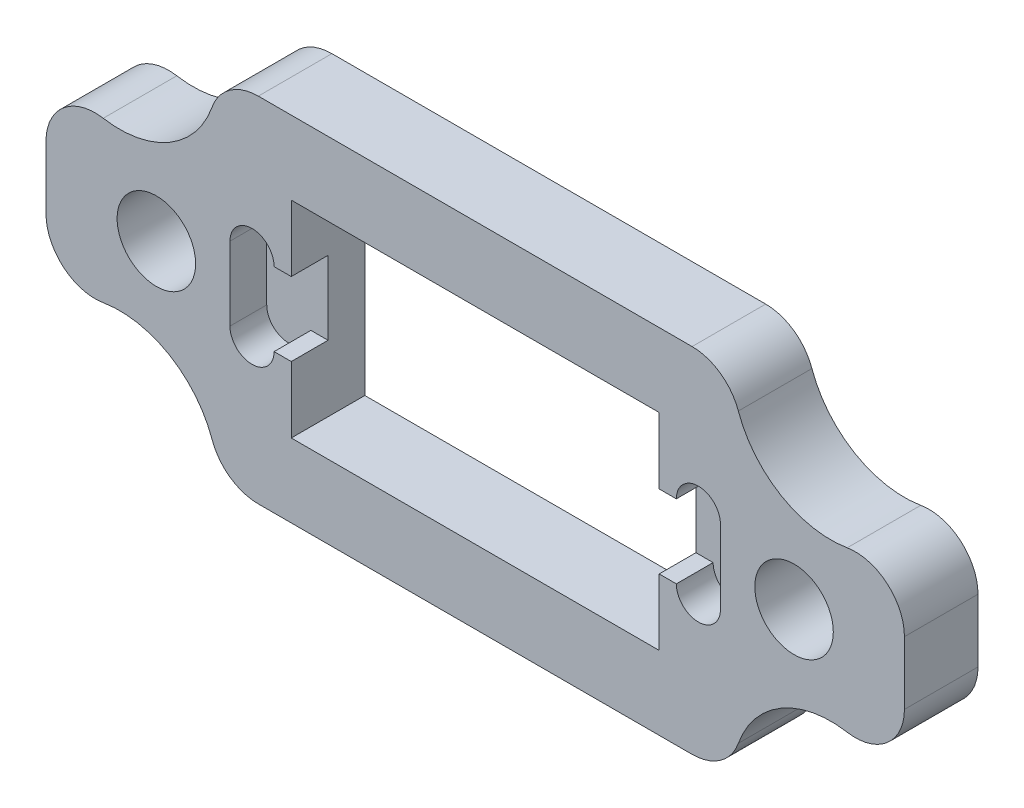
ISO-10303-21;
HEADER;
FILE_DESCRIPTION(('STEP AP214'),'2;1');
FILE_NAME('part.step','',(''),(''),'','','');
FILE_SCHEMA(('AUTOMOTIVE_DESIGN { 1 0 10303 214 1 1 1 1 }'));
ENDSEC;
DATA;
#1=APPLICATION_CONTEXT('core data for automotive mechanical design processes');
#2=APPLICATION_PROTOCOL_DEFINITION('international standard','automotive_design',2000,#1);
#3=PRODUCT_CONTEXT('',#1,'mechanical');
#4=PRODUCT('Part','Part','',(#3));
#5=PRODUCT_RELATED_PRODUCT_CATEGORY('part','',(#4));
#6=PRODUCT_DEFINITION_FORMATION('','',#4);
#7=PRODUCT_DEFINITION_CONTEXT('part definition',#1,'design');
#8=PRODUCT_DEFINITION('design','',#6,#7);
#9=PRODUCT_DEFINITION_SHAPE('','',#8);
#10=(LENGTH_UNIT() NAMED_UNIT(*) SI_UNIT(.MILLI.,.METRE.));
#11=(NAMED_UNIT(*) PLANE_ANGLE_UNIT() SI_UNIT($,.RADIAN.));
#12=(NAMED_UNIT(*) SI_UNIT($,.STERADIAN.) SOLID_ANGLE_UNIT());
#13=UNCERTAINTY_MEASURE_WITH_UNIT(LENGTH_MEASURE(1.E-05),#10,'distance_accuracy_value','');
#14=(GEOMETRIC_REPRESENTATION_CONTEXT(3) GLOBAL_UNCERTAINTY_ASSIGNED_CONTEXT((#13)) GLOBAL_UNIT_ASSIGNED_CONTEXT((#10,
#11,#12)) REPRESENTATION_CONTEXT('',''));
#15=CARTESIAN_POINT('',(0.,0.,0.));
#16=DIRECTION('',(0.,0.,1.));
#17=DIRECTION('',(1.,0.,0.));
#18=AXIS2_PLACEMENT_3D('',#15,#16,#17);
#19=CARTESIAN_POINT('',(0.,0.,3.));
#20=DIRECTION('',(0.,0.,-1.));
#21=DIRECTION('',(-1.,0.,0.));
#22=AXIS2_PLACEMENT_3D('',#19,#20,#21);
#23=PLANE('',#22);
#24=CARTESIAN_POINT('',(-13.,0.,3.));
#25=DIRECTION('',(0.,0.,1.));
#26=DIRECTION('',(1.,0.,0.));
#27=AXIS2_PLACEMENT_3D('',#24,#25,#26);
#28=CIRCLE('',#27,1.6);
#29=CARTESIAN_POINT('',(-11.4,0.,3.));
#30=VERTEX_POINT('',#29);
#31=EDGE_CURVE('E411',#30,#30,#28,.T.);
#32=ORIENTED_EDGE('',*,*,#31,.F.);
#33=EDGE_LOOP('',(#32));
#34=FACE_BOUND('',#33,.T.);
#35=CARTESIAN_POINT('',(13.,0.,3.));
#36=DIRECTION('',(0.,0.,1.));
#37=DIRECTION('',(1.,0.,0.));
#38=AXIS2_PLACEMENT_3D('',#35,#36,#37);
#39=CIRCLE('',#38,1.6);
#40=CARTESIAN_POINT('',(14.6,0.,3.));
#41=VERTEX_POINT('',#40);
#42=EDGE_CURVE('E548',#41,#41,#39,.T.);
#43=ORIENTED_EDGE('',*,*,#42,.F.);
#44=EDGE_LOOP('',(#43));
#45=FACE_BOUND('',#44,.T.);
#46=CARTESIAN_POINT('',(-14.5,-7.2,3.));
#47=DIRECTION('',(0.,0.,1.));
#48=DIRECTION('',(-1.,0.,0.));
#49=AXIS2_PLACEMENT_3D('',#46,#47,#48);
#50=CIRCLE('',#49,4.);
#51=CARTESIAN_POINT('',(-10.7287638336717,-5.86666666666667,3.));
#52=VERTEX_POINT('',#51);
#53=CARTESIAN_POINT('',(-15.1666666666667,-3.25594681126692,3.));
#54=VERTEX_POINT('',#53);
#55=EDGE_CURVE('E695',#52,#54,#50,.T.);
#56=ORIENTED_EDGE('',*,*,#55,.F.);
#57=CARTESIAN_POINT('',(-8.84314575050762,-5.2,3.));
#58=DIRECTION('',(0.,0.,-1.));
#59=DIRECTION('',(-1.,0.,0.));
#60=AXIS2_PLACEMENT_3D('',#57,#58,#59);
#61=CIRCLE('',#60,2.);
#62=CARTESIAN_POINT('',(-8.84314575050762,-7.2,3.));
#63=VERTEX_POINT('',#62);
#64=EDGE_CURVE('E472',#52,#63,#61,.F.);
#65=ORIENTED_EDGE('',*,*,#64,.T.);
#66=DIRECTION('',(1.,0.,0.));
#67=VECTOR('',#66,1.);
#68=CARTESIAN_POINT('',(-17.5,-7.2,3.));
#69=LINE('',#68,#67);
#70=CARTESIAN_POINT('',(8.84314575050763,-7.2,3.));
#71=VERTEX_POINT('',#70);
#72=EDGE_CURVE('E377',#63,#71,#69,.T.);
#73=ORIENTED_EDGE('',*,*,#72,.T.);
#74=CARTESIAN_POINT('',(8.84314575050763,-5.2,3.));
#75=DIRECTION('',(0.,0.,-1.));
#76=DIRECTION('',(-1.,0.,0.));
#77=AXIS2_PLACEMENT_3D('',#74,#75,#76);
#78=CIRCLE('',#77,2.);
#79=CARTESIAN_POINT('',(10.7287638336718,-5.86666666666667,3.));
#80=VERTEX_POINT('',#79);
#81=EDGE_CURVE('E469',#71,#80,#78,.F.);
#82=ORIENTED_EDGE('',*,*,#81,.T.);
#83=CARTESIAN_POINT('',(14.5,-7.2,3.));
#84=DIRECTION('',(0.,0.,1.));
#85=DIRECTION('',(1.,0.,0.));
#86=AXIS2_PLACEMENT_3D('',#83,#84,#85);
#87=CIRCLE('',#86,4.);
#88=CARTESIAN_POINT('',(15.1666666666667,-3.25594681126692,3.));
#89=VERTEX_POINT('',#88);
#90=EDGE_CURVE('E692',#89,#80,#87,.T.);
#91=ORIENTED_EDGE('',*,*,#90,.F.);
#92=CARTESIAN_POINT('',(15.5,-1.28392021690038,3.));
#93=DIRECTION('',(0.,0.,-1.));
#94=DIRECTION('',(-1.,0.,0.));
#95=AXIS2_PLACEMENT_3D('',#92,#93,#94);
#96=CIRCLE('',#95,2.);
#97=CARTESIAN_POINT('',(17.5,-1.28392021690038,3.));
#98=VERTEX_POINT('',#97);
#99=EDGE_CURVE('E466',#89,#98,#96,.F.);
#100=ORIENTED_EDGE('',*,*,#99,.T.);
#101=DIRECTION('',(0.,1.,0.));
#102=VECTOR('',#101,1.);
#103=CARTESIAN_POINT('',(17.5,-7.2,3.));
#104=LINE('',#103,#102);
#105=CARTESIAN_POINT('',(17.5,1.28392021690038,3.));
#106=VERTEX_POINT('',#105);
#107=EDGE_CURVE('E365',#98,#106,#104,.T.);
#108=ORIENTED_EDGE('',*,*,#107,.T.);
#109=CARTESIAN_POINT('',(15.5,1.28392021690038,3.));
#110=DIRECTION('',(0.,0.,-1.));
#111=DIRECTION('',(-1.,0.,0.));
#112=AXIS2_PLACEMENT_3D('',#109,#110,#111);
#113=CIRCLE('',#112,2.);
#114=CARTESIAN_POINT('',(15.1666666666667,3.25594681126692,3.));
#115=VERTEX_POINT('',#114);
#116=EDGE_CURVE('E463',#106,#115,#113,.F.);
#117=ORIENTED_EDGE('',*,*,#116,.T.);
#118=CARTESIAN_POINT('',(14.5,7.2,3.));
#119=DIRECTION('',(0.,0.,1.));
#120=DIRECTION('',(-1.,0.,0.));
#121=AXIS2_PLACEMENT_3D('',#118,#119,#120);
#122=CIRCLE('',#121,4.);
#123=CARTESIAN_POINT('',(10.7287638336718,5.86666666666667,3.));
#124=VERTEX_POINT('',#123);
#125=EDGE_CURVE('E537',#124,#115,#122,.T.);
#126=ORIENTED_EDGE('',*,*,#125,.F.);
#127=CARTESIAN_POINT('',(8.84314575050763,5.2,3.));
#128=DIRECTION('',(0.,0.,-1.));
#129=DIRECTION('',(-1.,0.,0.));
#130=AXIS2_PLACEMENT_3D('',#127,#128,#129);
#131=CIRCLE('',#130,2.);
#132=CARTESIAN_POINT('',(8.84314575050763,7.2,3.));
#133=VERTEX_POINT('',#132);
#134=EDGE_CURVE('E460',#124,#133,#131,.F.);
#135=ORIENTED_EDGE('',*,*,#134,.T.);
#136=DIRECTION('',(-1.,0.,0.));
#137=VECTOR('',#136,1.);
#138=CARTESIAN_POINT('',(-17.5,7.2,3.));
#139=LINE('',#138,#137);
#140=CARTESIAN_POINT('',(-8.84314575050762,7.2,3.));
#141=VERTEX_POINT('',#140);
#142=EDGE_CURVE('E369',#133,#141,#139,.T.);
#143=ORIENTED_EDGE('',*,*,#142,.T.);
#144=CARTESIAN_POINT('',(-8.84314575050762,5.2,3.));
#145=DIRECTION('',(0.,0.,-1.));
#146=DIRECTION('',(-1.,0.,0.));
#147=AXIS2_PLACEMENT_3D('',#144,#145,#146);
#148=CIRCLE('',#147,2.);
#149=CARTESIAN_POINT('',(-10.7287638336717,5.86666666666667,3.));
#150=VERTEX_POINT('',#149);
#151=EDGE_CURVE('E61',#141,#150,#148,.F.);
#152=ORIENTED_EDGE('',*,*,#151,.T.);
#153=CARTESIAN_POINT('',(-14.5,7.2,3.));
#154=DIRECTION('',(0.,0.,1.));
#155=DIRECTION('',(1.,0.,0.));
#156=AXIS2_PLACEMENT_3D('',#153,#154,#155);
#157=CIRCLE('',#156,4.);
#158=CARTESIAN_POINT('',(-15.1666666666667,3.25594681126692,3.));
#159=VERTEX_POINT('',#158);
#160=EDGE_CURVE('E515',#159,#150,#157,.T.);
#161=ORIENTED_EDGE('',*,*,#160,.F.);
#162=CARTESIAN_POINT('',(-15.5,1.28392021690038,3.));
#163=DIRECTION('',(0.,0.,-1.));
#164=DIRECTION('',(-1.,0.,0.));
#165=AXIS2_PLACEMENT_3D('',#162,#163,#164);
#166=CIRCLE('',#165,2.);
#167=CARTESIAN_POINT('',(-17.5,1.28392021690038,3.));
#168=VERTEX_POINT('',#167);
#169=EDGE_CURVE('E457',#159,#168,#166,.F.);
#170=ORIENTED_EDGE('',*,*,#169,.T.);
#171=DIRECTION('',(0.,-1.,0.));
#172=VECTOR('',#171,1.);
#173=CARTESIAN_POINT('',(-17.5,-7.2,3.));
#174=LINE('',#173,#172);
#175=CARTESIAN_POINT('',(-17.5,-1.28392021690038,3.));
#176=VERTEX_POINT('',#175);
#177=EDGE_CURVE('E373',#168,#176,#174,.T.);
#178=ORIENTED_EDGE('',*,*,#177,.T.);
#179=CARTESIAN_POINT('',(-15.5,-1.28392021690038,3.));
#180=DIRECTION('',(0.,0.,-1.));
#181=DIRECTION('',(-1.,0.,0.));
#182=AXIS2_PLACEMENT_3D('',#179,#180,#181);
#183=CIRCLE('',#182,2.);
#184=EDGE_CURVE('E454',#176,#54,#183,.F.);
#185=ORIENTED_EDGE('',*,*,#184,.T.);
#186=EDGE_LOOP('',(#56,#65,#73,#82,#91,#100,#108,#117,#126,#135,#143,#152,#161,#170,#178,#185));
#187=FACE_BOUND('',#186,.T.);
#188=DIRECTION('',(1.,0.,0.));
#189=VECTOR('',#188,1.);
#190=CARTESIAN_POINT('',(-10.,-1.5,3.));
#191=LINE('',#190,#189);
#192=CARTESIAN_POINT('',(-8.2,-1.5,3.));
#193=VERTEX_POINT('',#192);
#194=CARTESIAN_POINT('',(-7.5,-1.5,3.));
#195=VERTEX_POINT('',#194);
#196=EDGE_CURVE('E285',#193,#195,#191,.T.);
#197=ORIENTED_EDGE('',*,*,#196,.F.);
#198=CARTESIAN_POINT('',(-9.1,-1.5,3.));
#199=DIRECTION('',(0.,0.,1.));
#200=DIRECTION('',(1.,0.,0.));
#201=AXIS2_PLACEMENT_3D('',#198,#199,#200);
#202=CIRCLE('',#201,0.9);
#203=CARTESIAN_POINT('',(-10.,-1.5,3.));
#204=VERTEX_POINT('',#203);
#205=EDGE_CURVE('E728',#204,#193,#202,.T.);
#206=ORIENTED_EDGE('',*,*,#205,.F.);
#207=DIRECTION('',(0.,-1.,0.));
#208=VECTOR('',#207,1.);
#209=CARTESIAN_POINT('',(-10.,-1.5,3.));
#210=LINE('',#209,#208);
#211=CARTESIAN_POINT('',(-10.,1.5,3.));
#212=VERTEX_POINT('',#211);
#213=EDGE_CURVE('E286',#212,#204,#210,.T.);
#214=ORIENTED_EDGE('',*,*,#213,.F.);
#215=CARTESIAN_POINT('',(-9.1,1.5,3.));
#216=DIRECTION('',(0.,0.,1.));
#217=DIRECTION('',(1.,0.,0.));
#218=AXIS2_PLACEMENT_3D('',#215,#216,#217);
#219=CIRCLE('',#218,0.9);
#220=CARTESIAN_POINT('',(-8.2,1.5,3.));
#221=VERTEX_POINT('',#220);
#222=EDGE_CURVE('E593',#221,#212,#219,.T.);
#223=ORIENTED_EDGE('',*,*,#222,.F.);
#224=DIRECTION('',(-1.,0.,0.));
#225=VECTOR('',#224,1.);
#226=CARTESIAN_POINT('',(-10.,1.5,3.));
#227=LINE('',#226,#225);
#228=CARTESIAN_POINT('',(-7.5,1.5,3.));
#229=VERTEX_POINT('',#228);
#230=EDGE_CURVE('E573',#229,#221,#227,.T.);
#231=ORIENTED_EDGE('',*,*,#230,.F.);
#232=DIRECTION('',(0.,-1.,0.));
#233=VECTOR('',#232,1.);
#234=CARTESIAN_POINT('',(-7.5,-4.2,3.));
#235=LINE('',#234,#233);
#236=CARTESIAN_POINT('',(-7.5,4.2,3.));
#237=VERTEX_POINT('',#236);
#238=EDGE_CURVE('E328',#237,#229,#235,.T.);
#239=ORIENTED_EDGE('',*,*,#238,.F.);
#240=DIRECTION('',(-1.,0.,0.));
#241=VECTOR('',#240,1.);
#242=CARTESIAN_POINT('',(-7.5,4.2,3.));
#243=LINE('',#242,#241);
#244=CARTESIAN_POINT('',(7.5,4.2,3.));
#245=VERTEX_POINT('',#244);
#246=EDGE_CURVE('E323',#245,#237,#243,.T.);
#247=ORIENTED_EDGE('',*,*,#246,.F.);
#248=DIRECTION('',(0.,1.,0.));
#249=VECTOR('',#248,1.);
#250=CARTESIAN_POINT('',(7.5,-4.2,3.));
#251=LINE('',#250,#249);
#252=CARTESIAN_POINT('',(7.5,1.5,3.));
#253=VERTEX_POINT('',#252);
#254=EDGE_CURVE('E324',#253,#245,#251,.T.);
#255=ORIENTED_EDGE('',*,*,#254,.F.);
#256=CARTESIAN_POINT('',(8.2,1.5,3.));
#257=VERTEX_POINT('',#256);
#258=EDGE_CURVE('E292',#257,#253,#227,.T.);
#259=ORIENTED_EDGE('',*,*,#258,.F.);
#260=CARTESIAN_POINT('',(9.1,1.5,3.));
#261=DIRECTION('',(0.,0.,1.));
#262=DIRECTION('',(1.,0.,0.));
#263=AXIS2_PLACEMENT_3D('',#260,#261,#262);
#264=CIRCLE('',#263,0.9);
#265=CARTESIAN_POINT('',(10.,1.5,3.));
#266=VERTEX_POINT('',#265);
#267=EDGE_CURVE('E734',#266,#257,#264,.T.);
#268=ORIENTED_EDGE('',*,*,#267,.F.);
#269=DIRECTION('',(0.,1.,0.));
#270=VECTOR('',#269,1.);
#271=CARTESIAN_POINT('',(10.,-1.5,3.));
#272=LINE('',#271,#270);
#273=CARTESIAN_POINT('',(10.,-1.5,3.));
#274=VERTEX_POINT('',#273);
#275=EDGE_CURVE('E277',#274,#266,#272,.T.);
#276=ORIENTED_EDGE('',*,*,#275,.F.);
#277=CARTESIAN_POINT('',(9.1,-1.5,3.));
#278=DIRECTION('',(0.,0.,1.));
#279=DIRECTION('',(1.,0.,0.));
#280=AXIS2_PLACEMENT_3D('',#277,#278,#279);
#281=CIRCLE('',#280,0.9);
#282=CARTESIAN_POINT('',(8.2,-1.5,3.));
#283=VERTEX_POINT('',#282);
#284=EDGE_CURVE('E256',#283,#274,#281,.T.);
#285=ORIENTED_EDGE('',*,*,#284,.F.);
#286=CARTESIAN_POINT('',(7.5,-1.5,3.));
#287=VERTEX_POINT('',#286);
#288=EDGE_CURVE('E273',#287,#283,#191,.T.);
#289=ORIENTED_EDGE('',*,*,#288,.F.);
#290=CARTESIAN_POINT('',(7.5,-4.2,3.));
#291=VERTEX_POINT('',#290);
#292=EDGE_CURVE('E320',#291,#287,#251,.T.);
#293=ORIENTED_EDGE('',*,*,#292,.F.);
#294=DIRECTION('',(1.,0.,0.));
#295=VECTOR('',#294,1.);
#296=CARTESIAN_POINT('',(-7.5,-4.2,3.));
#297=LINE('',#296,#295);
#298=CARTESIAN_POINT('',(-7.5,-4.2,3.));
#299=VERTEX_POINT('',#298);
#300=EDGE_CURVE('E332',#299,#291,#297,.T.);
#301=ORIENTED_EDGE('',*,*,#300,.F.);
#302=EDGE_CURVE('E327',#195,#299,#235,.T.);
#303=ORIENTED_EDGE('',*,*,#302,.F.);
#304=EDGE_LOOP('',(#197,#206,#214,#223,#231,#239,#247,#255,#259,#268,#276,#285,#289,#293,#301,#303));
#305=FACE_BOUND('',#304,.T.);
#306=ADVANCED_FACE('F45',(#34,#45,#187,#305),#23,.F.);
#307=CARTESIAN_POINT('',(0.,0.,0.));
#308=DIRECTION('',(0.,0.,-1.));
#309=DIRECTION('',(-1.,0.,0.));
#310=AXIS2_PLACEMENT_3D('',#307,#308,#309);
#311=PLANE('',#310);
#312=DIRECTION('',(1.,0.,0.));
#313=VECTOR('',#312,1.);
#314=CARTESIAN_POINT('',(-17.5,-7.2,0.));
#315=LINE('',#314,#313);
#316=CARTESIAN_POINT('',(-8.84314575050762,-7.2,0.));
#317=VERTEX_POINT('',#316);
#318=CARTESIAN_POINT('',(8.84314575050763,-7.2,0.));
#319=VERTEX_POINT('',#318);
#320=EDGE_CURVE('E370',#317,#319,#315,.T.);
#321=ORIENTED_EDGE('',*,*,#320,.F.);
#322=CARTESIAN_POINT('',(-8.84314575050762,-5.2,0.));
#323=DIRECTION('',(0.,0.,-1.));
#324=DIRECTION('',(-1.,0.,0.));
#325=AXIS2_PLACEMENT_3D('',#322,#323,#324);
#326=CIRCLE('',#325,2.);
#327=CARTESIAN_POINT('',(-10.7287638336717,-5.86666666666667,0.));
#328=VERTEX_POINT('',#327);
#329=EDGE_CURVE('E443',#317,#328,#326,.T.);
#330=ORIENTED_EDGE('',*,*,#329,.T.);
#331=CARTESIAN_POINT('',(-14.5,-7.2,0.));
#332=DIRECTION('',(0.,0.,-1.));
#333=DIRECTION('',(-1.,0.,0.));
#334=AXIS2_PLACEMENT_3D('',#331,#332,#333);
#335=CIRCLE('',#334,4.);
#336=CARTESIAN_POINT('',(-15.1666666666667,-3.25594681126692,0.));
#337=VERTEX_POINT('',#336);
#338=EDGE_CURVE('E526',#337,#328,#335,.T.);
#339=ORIENTED_EDGE('',*,*,#338,.F.);
#340=CARTESIAN_POINT('',(-15.5,-1.28392021690038,0.));
#341=DIRECTION('',(0.,0.,-1.));
#342=DIRECTION('',(-1.,0.,0.));
#343=AXIS2_PLACEMENT_3D('',#340,#341,#342);
#344=CIRCLE('',#343,2.);
#345=CARTESIAN_POINT('',(-17.5,-1.28392021690038,0.));
#346=VERTEX_POINT('',#345);
#347=EDGE_CURVE('E425',#337,#346,#344,.T.);
#348=ORIENTED_EDGE('',*,*,#347,.T.);
#349=DIRECTION('',(0.,-1.,0.));
#350=VECTOR('',#349,1.);
#351=CARTESIAN_POINT('',(-17.5,-7.2,0.));
#352=LINE('',#351,#350);
#353=CARTESIAN_POINT('',(-17.5,1.28392021690038,0.));
#354=VERTEX_POINT('',#353);
#355=EDGE_CURVE('E389',#354,#346,#352,.T.);
#356=ORIENTED_EDGE('',*,*,#355,.F.);
#357=CARTESIAN_POINT('',(-15.5,1.28392021690038,0.));
#358=DIRECTION('',(0.,0.,-1.));
#359=DIRECTION('',(-1.,0.,0.));
#360=AXIS2_PLACEMENT_3D('',#357,#358,#359);
#361=CIRCLE('',#360,2.);
#362=CARTESIAN_POINT('',(-15.1666666666667,3.25594681126692,0.));
#363=VERTEX_POINT('',#362);
#364=EDGE_CURVE('E428',#354,#363,#361,.T.);
#365=ORIENTED_EDGE('',*,*,#364,.T.);
#366=CARTESIAN_POINT('',(-14.5,7.2,0.));
#367=DIRECTION('',(0.,0.,-1.));
#368=DIRECTION('',(-1.,0.,0.));
#369=AXIS2_PLACEMENT_3D('',#366,#367,#368);
#370=CIRCLE('',#369,4.);
#371=CARTESIAN_POINT('',(-10.7287638336717,5.86666666666667,0.));
#372=VERTEX_POINT('',#371);
#373=EDGE_CURVE('E514',#372,#363,#370,.T.);
#374=ORIENTED_EDGE('',*,*,#373,.F.);
#375=CARTESIAN_POINT('',(-8.84314575050762,5.2,0.));
#376=DIRECTION('',(0.,0.,-1.));
#377=DIRECTION('',(-1.,0.,0.));
#378=AXIS2_PLACEMENT_3D('',#375,#376,#377);
#379=CIRCLE('',#378,2.);
#380=CARTESIAN_POINT('',(-8.84314575050762,7.2,0.));
#381=VERTEX_POINT('',#380);
#382=EDGE_CURVE('E422',#372,#381,#379,.T.);
#383=ORIENTED_EDGE('',*,*,#382,.T.);
#384=DIRECTION('',(-1.,0.,0.));
#385=VECTOR('',#384,1.);
#386=CARTESIAN_POINT('',(-17.5,7.2,0.));
#387=LINE('',#386,#385);
#388=CARTESIAN_POINT('',(8.84314575050763,7.2,0.));
#389=VERTEX_POINT('',#388);
#390=EDGE_CURVE('E385',#389,#381,#387,.T.);
#391=ORIENTED_EDGE('',*,*,#390,.F.);
#392=CARTESIAN_POINT('',(8.84314575050763,5.2,0.));
#393=DIRECTION('',(0.,0.,-1.));
#394=DIRECTION('',(-1.,0.,0.));
#395=AXIS2_PLACEMENT_3D('',#392,#393,#394);
#396=CIRCLE('',#395,2.);
#397=CARTESIAN_POINT('',(10.7287638336718,5.86666666666667,0.));
#398=VERTEX_POINT('',#397);
#399=EDGE_CURVE('E431',#389,#398,#396,.T.);
#400=ORIENTED_EDGE('',*,*,#399,.T.);
#401=CARTESIAN_POINT('',(14.5,7.2,0.));
#402=DIRECTION('',(0.,0.,-1.));
#403=DIRECTION('',(-1.,0.,0.));
#404=AXIS2_PLACEMENT_3D('',#401,#402,#403);
#405=CIRCLE('',#404,4.);
#406=CARTESIAN_POINT('',(15.1666666666667,3.25594681126692,0.));
#407=VERTEX_POINT('',#406);
#408=EDGE_CURVE('E525',#407,#398,#405,.T.);
#409=ORIENTED_EDGE('',*,*,#408,.F.);
#410=CARTESIAN_POINT('',(15.5,1.28392021690038,0.));
#411=DIRECTION('',(0.,0.,-1.));
#412=DIRECTION('',(-1.,0.,0.));
#413=AXIS2_PLACEMENT_3D('',#410,#411,#412);
#414=CIRCLE('',#413,2.);
#415=CARTESIAN_POINT('',(17.5,1.28392021690038,0.));
#416=VERTEX_POINT('',#415);
#417=EDGE_CURVE('E434',#407,#416,#414,.T.);
#418=ORIENTED_EDGE('',*,*,#417,.T.);
#419=DIRECTION('',(0.,1.,0.));
#420=VECTOR('',#419,1.);
#421=CARTESIAN_POINT('',(17.5,-7.2,0.));
#422=LINE('',#421,#420);
#423=CARTESIAN_POINT('',(17.5,-1.28392021690038,0.));
#424=VERTEX_POINT('',#423);
#425=EDGE_CURVE('E364',#424,#416,#422,.T.);
#426=ORIENTED_EDGE('',*,*,#425,.F.);
#427=CARTESIAN_POINT('',(15.5,-1.28392021690038,0.));
#428=DIRECTION('',(0.,0.,-1.));
#429=DIRECTION('',(-1.,0.,0.));
#430=AXIS2_PLACEMENT_3D('',#427,#428,#429);
#431=CIRCLE('',#430,2.);
#432=CARTESIAN_POINT('',(15.1666666666667,-3.25594681126692,0.));
#433=VERTEX_POINT('',#432);
#434=EDGE_CURVE('E437',#424,#433,#431,.T.);
#435=ORIENTED_EDGE('',*,*,#434,.T.);
#436=CARTESIAN_POINT('',(14.5,-7.2,0.));
#437=DIRECTION('',(0.,0.,-1.));
#438=DIRECTION('',(-1.,0.,0.));
#439=AXIS2_PLACEMENT_3D('',#436,#437,#438);
#440=CIRCLE('',#439,4.);
#441=CARTESIAN_POINT('',(10.7287638336718,-5.86666666666667,0.));
#442=VERTEX_POINT('',#441);
#443=EDGE_CURVE('E686',#442,#433,#440,.T.);
#444=ORIENTED_EDGE('',*,*,#443,.F.);
#445=CARTESIAN_POINT('',(8.84314575050763,-5.2,0.));
#446=DIRECTION('',(0.,0.,-1.));
#447=DIRECTION('',(-1.,0.,0.));
#448=AXIS2_PLACEMENT_3D('',#445,#446,#447);
#449=CIRCLE('',#448,2.);
#450=EDGE_CURVE('E440',#442,#319,#449,.T.);
#451=ORIENTED_EDGE('',*,*,#450,.T.);
#452=EDGE_LOOP('',(#321,#330,#339,#348,#356,#365,#374,#383,#391,#400,#409,#418,#426,#435,#444,#451));
#453=FACE_BOUND('',#452,.T.);
#454=CARTESIAN_POINT('',(-13.,0.,0.));
#455=DIRECTION('',(0.,0.,-1.));
#456=DIRECTION('',(-1.,0.,0.));
#457=AXIS2_PLACEMENT_3D('',#454,#455,#456);
#458=CIRCLE('',#457,1.6);
#459=CARTESIAN_POINT('',(-14.6,0.,0.));
#460=VERTEX_POINT('',#459);
#461=EDGE_CURVE('E410',#460,#460,#458,.T.);
#462=ORIENTED_EDGE('',*,*,#461,.F.);
#463=EDGE_LOOP('',(#462));
#464=FACE_BOUND('',#463,.T.);
#465=CARTESIAN_POINT('',(13.,0.,0.));
#466=DIRECTION('',(0.,0.,-1.));
#467=DIRECTION('',(-1.,0.,0.));
#468=AXIS2_PLACEMENT_3D('',#465,#466,#467);
#469=CIRCLE('',#468,1.6);
#470=CARTESIAN_POINT('',(11.4,0.,0.));
#471=VERTEX_POINT('',#470);
#472=EDGE_CURVE('E406',#471,#471,#469,.T.);
#473=ORIENTED_EDGE('',*,*,#472,.F.);
#474=EDGE_LOOP('',(#473));
#475=FACE_BOUND('',#474,.T.);
#476=DIRECTION('',(1.,0.,0.));
#477=VECTOR('',#476,1.);
#478=CARTESIAN_POINT('',(-7.5,-4.2,0.));
#479=LINE('',#478,#477);
#480=CARTESIAN_POINT('',(-7.5,-4.2,0.));
#481=VERTEX_POINT('',#480);
#482=CARTESIAN_POINT('',(7.5,-4.2,0.));
#483=VERTEX_POINT('',#482);
#484=EDGE_CURVE('E347',#481,#483,#479,.T.);
#485=ORIENTED_EDGE('',*,*,#484,.T.);
#486=DIRECTION('',(0.,1.,0.));
#487=VECTOR('',#486,1.);
#488=CARTESIAN_POINT('',(7.5,-4.2,0.));
#489=LINE('',#488,#487);
#490=CARTESIAN_POINT('',(7.5,4.2,0.));
#491=VERTEX_POINT('',#490);
#492=EDGE_CURVE('E319',#483,#491,#489,.T.);
#493=ORIENTED_EDGE('',*,*,#492,.T.);
#494=DIRECTION('',(-1.,0.,0.));
#495=VECTOR('',#494,1.);
#496=CARTESIAN_POINT('',(-7.5,4.2,0.));
#497=LINE('',#496,#495);
#498=CARTESIAN_POINT('',(-7.5,4.2,0.));
#499=VERTEX_POINT('',#498);
#500=EDGE_CURVE('E339',#491,#499,#497,.T.);
#501=ORIENTED_EDGE('',*,*,#500,.T.);
#502=DIRECTION('',(0.,-1.,0.));
#503=VECTOR('',#502,1.);
#504=CARTESIAN_POINT('',(-7.5,-4.2,0.));
#505=LINE('',#504,#503);
#506=EDGE_CURVE('E343',#499,#481,#505,.T.);
#507=ORIENTED_EDGE('',*,*,#506,.T.);
#508=EDGE_LOOP('',(#485,#493,#501,#507));
#509=FACE_BOUND('',#508,.T.);
#510=ADVANCED_FACE('F520',(#453,#464,#475,#509),#311,.T.);
#511=CARTESIAN_POINT('',(17.5,-7.2,3.));
#512=DIRECTION('',(-1.,0.,0.));
#513=DIRECTION('',(0.,0.,1.));
#514=AXIS2_PLACEMENT_3D('',#511,#512,#513);
#515=PLANE('',#514);
#516=ORIENTED_EDGE('',*,*,#107,.F.);
#517=DIRECTION('',(0.,0.,1.));
#518=VECTOR('',#517,1.);
#519=CARTESIAN_POINT('',(17.5,-1.28392021690038,3.));
#520=LINE('',#519,#518);
#521=EDGE_CURVE('E485',#98,#424,#520,.F.);
#522=ORIENTED_EDGE('',*,*,#521,.T.);
#523=ORIENTED_EDGE('',*,*,#425,.T.);
#524=DIRECTION('',(0.,0.,1.));
#525=VECTOR('',#524,1.);
#526=CARTESIAN_POINT('',(17.5,1.28392021690038,3.));
#527=LINE('',#526,#525);
#528=EDGE_CURVE('E481',#416,#106,#527,.T.);
#529=ORIENTED_EDGE('',*,*,#528,.T.);
#530=EDGE_LOOP('',(#516,#522,#523,#529));
#531=FACE_BOUND('',#530,.T.);
#532=ADVANCED_FACE('F627',(#531),#515,.F.);
#533=CARTESIAN_POINT('',(-17.5,7.2,3.));
#534=DIRECTION('',(0.,-1.,0.));
#535=DIRECTION('',(0.,0.,-1.));
#536=AXIS2_PLACEMENT_3D('',#533,#534,#535);
#537=PLANE('',#536);
#538=ORIENTED_EDGE('',*,*,#142,.F.);
#539=DIRECTION('',(0.,0.,1.));
#540=VECTOR('',#539,1.);
#541=CARTESIAN_POINT('',(8.84314575050763,7.2,3.));
#542=LINE('',#541,#540);
#543=EDGE_CURVE('E499',#133,#389,#542,.F.);
#544=ORIENTED_EDGE('',*,*,#543,.T.);
#545=ORIENTED_EDGE('',*,*,#390,.T.);
#546=DIRECTION('',(0.,0.,1.));
#547=VECTOR('',#546,1.);
#548=CARTESIAN_POINT('',(-8.84314575050762,7.2,3.));
#549=LINE('',#548,#547);
#550=EDGE_CURVE('E495',#381,#141,#549,.T.);
#551=ORIENTED_EDGE('',*,*,#550,.T.);
#552=EDGE_LOOP('',(#538,#544,#545,#551));
#553=FACE_BOUND('',#552,.T.);
#554=ADVANCED_FACE('F531',(#553),#537,.F.);
#555=CARTESIAN_POINT('',(-17.5,-7.2,3.));
#556=DIRECTION('',(1.,0.,0.));
#557=DIRECTION('',(0.,0.,-1.));
#558=AXIS2_PLACEMENT_3D('',#555,#556,#557);
#559=PLANE('',#558);
#560=ORIENTED_EDGE('',*,*,#177,.F.);
#561=DIRECTION('',(0.,0.,1.));
#562=VECTOR('',#561,1.);
#563=CARTESIAN_POINT('',(-17.5,1.28392021690038,3.));
#564=LINE('',#563,#562);
#565=EDGE_CURVE('E507',#168,#354,#564,.F.);
#566=ORIENTED_EDGE('',*,*,#565,.T.);
#567=ORIENTED_EDGE('',*,*,#355,.T.);
#568=DIRECTION('',(0.,0.,1.));
#569=VECTOR('',#568,1.);
#570=CARTESIAN_POINT('',(-17.5,-1.28392021690038,3.));
#571=LINE('',#570,#569);
#572=EDGE_CURVE('E503',#346,#176,#571,.T.);
#573=ORIENTED_EDGE('',*,*,#572,.T.);
#574=EDGE_LOOP('',(#560,#566,#567,#573));
#575=FACE_BOUND('',#574,.T.);
#576=ADVANCED_FACE('F643',(#575),#559,.F.);
#577=CARTESIAN_POINT('',(-17.5,-7.2,3.));
#578=DIRECTION('',(0.,1.,0.));
#579=DIRECTION('',(0.,0.,1.));
#580=AXIS2_PLACEMENT_3D('',#577,#578,#579);
#581=PLANE('',#580);
#582=ORIENTED_EDGE('',*,*,#72,.F.);
#583=DIRECTION('',(0.,0.,1.));
#584=VECTOR('',#583,1.);
#585=CARTESIAN_POINT('',(-8.84314575050762,-7.2,3.));
#586=LINE('',#585,#584);
#587=EDGE_CURVE('E418',#63,#317,#586,.F.);
#588=ORIENTED_EDGE('',*,*,#587,.T.);
#589=ORIENTED_EDGE('',*,*,#320,.T.);
#590=DIRECTION('',(0.,0.,1.));
#591=VECTOR('',#590,1.);
#592=CARTESIAN_POINT('',(8.84314575050763,-7.2,3.));
#593=LINE('',#592,#591);
#594=EDGE_CURVE('E405',#319,#71,#593,.T.);
#595=ORIENTED_EDGE('',*,*,#594,.T.);
#596=EDGE_LOOP('',(#582,#588,#589,#595));
#597=FACE_BOUND('',#596,.T.);
#598=ADVANCED_FACE('F640',(#597),#581,.F.);
#599=CARTESIAN_POINT('',(7.5,-4.2,3.));
#600=DIRECTION('',(-1.,0.,0.));
#601=DIRECTION('',(0.,0.,1.));
#602=AXIS2_PLACEMENT_3D('',#599,#600,#601);
#603=PLANE('',#602);
#604=DIRECTION('',(0.,0.,1.));
#605=VECTOR('',#604,1.);
#606=CARTESIAN_POINT('',(7.5,-1.5,3.));
#607=LINE('',#606,#605);
#608=CARTESIAN_POINT('',(7.5,-1.5,1.5));
#609=VERTEX_POINT('',#608);
#610=EDGE_CURVE('E283',#609,#287,#607,.T.);
#611=ORIENTED_EDGE('',*,*,#610,.F.);
#612=DIRECTION('',(0.,-1.,0.));
#613=VECTOR('',#612,1.);
#614=CARTESIAN_POINT('',(7.5,-4.2,1.5));
#615=LINE('',#614,#613);
#616=CARTESIAN_POINT('',(7.5,1.5,1.5));
#617=VERTEX_POINT('',#616);
#618=EDGE_CURVE('E299',#617,#609,#615,.T.);
#619=ORIENTED_EDGE('',*,*,#618,.F.);
#620=DIRECTION('',(0.,0.,-1.));
#621=VECTOR('',#620,1.);
#622=CARTESIAN_POINT('',(7.5,1.5,3.));
#623=LINE('',#622,#621);
#624=EDGE_CURVE('E313',#253,#617,#623,.T.);
#625=ORIENTED_EDGE('',*,*,#624,.F.);
#626=ORIENTED_EDGE('',*,*,#254,.T.);
#627=DIRECTION('',(0.,0.,-1.));
#628=VECTOR('',#627,1.);
#629=CARTESIAN_POINT('',(7.5,4.2,3.));
#630=LINE('',#629,#628);
#631=EDGE_CURVE('E360',#245,#491,#630,.T.);
#632=ORIENTED_EDGE('',*,*,#631,.T.);
#633=ORIENTED_EDGE('',*,*,#492,.F.);
#634=DIRECTION('',(0.,0.,-1.));
#635=VECTOR('',#634,1.);
#636=CARTESIAN_POINT('',(7.5,-4.2,3.));
#637=LINE('',#636,#635);
#638=EDGE_CURVE('E335',#291,#483,#637,.T.);
#639=ORIENTED_EDGE('',*,*,#638,.F.);
#640=ORIENTED_EDGE('',*,*,#292,.T.);
#641=EDGE_LOOP('',(#611,#619,#625,#626,#632,#633,#639,#640));
#642=FACE_BOUND('',#641,.T.);
#643=ADVANCED_FACE('F624',(#642),#603,.T.);
#644=CARTESIAN_POINT('',(-7.5,4.2,3.));
#645=DIRECTION('',(0.,-1.,0.));
#646=DIRECTION('',(0.,0.,-1.));
#647=AXIS2_PLACEMENT_3D('',#644,#645,#646);
#648=PLANE('',#647);
#649=ORIENTED_EDGE('',*,*,#500,.F.);
#650=ORIENTED_EDGE('',*,*,#631,.F.);
#651=ORIENTED_EDGE('',*,*,#246,.T.);
#652=DIRECTION('',(0.,0.,-1.));
#653=VECTOR('',#652,1.);
#654=CARTESIAN_POINT('',(-7.5,4.2,3.));
#655=LINE('',#654,#653);
#656=EDGE_CURVE('E357',#237,#499,#655,.T.);
#657=ORIENTED_EDGE('',*,*,#656,.T.);
#658=EDGE_LOOP('',(#649,#650,#651,#657));
#659=FACE_BOUND('',#658,.T.);
#660=ADVANCED_FACE('F601',(#659),#648,.T.);
#661=CARTESIAN_POINT('',(-7.5,-4.2,3.));
#662=DIRECTION('',(1.,0.,0.));
#663=DIRECTION('',(0.,0.,-1.));
#664=AXIS2_PLACEMENT_3D('',#661,#662,#663);
#665=PLANE('',#664);
#666=DIRECTION('',(0.,0.,-1.));
#667=VECTOR('',#666,1.);
#668=CARTESIAN_POINT('',(-7.5,-1.5,3.));
#669=LINE('',#668,#667);
#670=CARTESIAN_POINT('',(-7.5,-1.5,1.5));
#671=VERTEX_POINT('',#670);
#672=EDGE_CURVE('E401',#195,#671,#669,.T.);
#673=ORIENTED_EDGE('',*,*,#672,.F.);
#674=ORIENTED_EDGE('',*,*,#302,.T.);
#675=DIRECTION('',(0.,0.,-1.));
#676=VECTOR('',#675,1.);
#677=CARTESIAN_POINT('',(-7.5,-4.2,3.));
#678=LINE('',#677,#676);
#679=EDGE_CURVE('E354',#299,#481,#678,.T.);
#680=ORIENTED_EDGE('',*,*,#679,.T.);
#681=ORIENTED_EDGE('',*,*,#506,.F.);
#682=ORIENTED_EDGE('',*,*,#656,.F.);
#683=ORIENTED_EDGE('',*,*,#238,.T.);
#684=DIRECTION('',(0.,0.,1.));
#685=VECTOR('',#684,1.);
#686=CARTESIAN_POINT('',(-7.5,1.5,3.));
#687=LINE('',#686,#685);
#688=CARTESIAN_POINT('',(-7.5,1.5,1.5));
#689=VERTEX_POINT('',#688);
#690=EDGE_CURVE('E398',#689,#229,#687,.T.);
#691=ORIENTED_EDGE('',*,*,#690,.F.);
#692=DIRECTION('',(0.,1.,0.));
#693=VECTOR('',#692,1.);
#694=CARTESIAN_POINT('',(-7.5,-4.2,1.5));
#695=LINE('',#694,#693);
#696=EDGE_CURVE('E381',#671,#689,#695,.T.);
#697=ORIENTED_EDGE('',*,*,#696,.F.);
#698=EDGE_LOOP('',(#673,#674,#680,#681,#682,#683,#691,#697));
#699=FACE_BOUND('',#698,.T.);
#700=ADVANCED_FACE('F597',(#699),#665,.T.);
#701=CARTESIAN_POINT('',(-7.5,-4.2,3.));
#702=DIRECTION('',(0.,1.,0.));
#703=DIRECTION('',(0.,0.,1.));
#704=AXIS2_PLACEMENT_3D('',#701,#702,#703);
#705=PLANE('',#704);
#706=ORIENTED_EDGE('',*,*,#484,.F.);
#707=ORIENTED_EDGE('',*,*,#679,.F.);
#708=ORIENTED_EDGE('',*,*,#300,.T.);
#709=ORIENTED_EDGE('',*,*,#638,.T.);
#710=EDGE_LOOP('',(#706,#707,#708,#709));
#711=FACE_BOUND('',#710,.T.);
#712=ADVANCED_FACE('F623',(#711),#705,.T.);
#713=CARTESIAN_POINT('',(0.,0.,1.5));
#714=DIRECTION('',(0.,0.,-1.));
#715=DIRECTION('',(-1.,0.,0.));
#716=AXIS2_PLACEMENT_3D('',#713,#714,#715);
#717=PLANE('',#716);
#718=DIRECTION('',(0.,-1.,0.));
#719=VECTOR('',#718,1.);
#720=CARTESIAN_POINT('',(-10.,-1.5,1.5));
#721=LINE('',#720,#719);
#722=CARTESIAN_POINT('',(-10.,1.5,1.5));
#723=VERTEX_POINT('',#722);
#724=CARTESIAN_POINT('',(-10.,-1.5,1.5));
#725=VERTEX_POINT('',#724);
#726=EDGE_CURVE('E565',#723,#725,#721,.T.);
#727=ORIENTED_EDGE('',*,*,#726,.T.);
#728=CARTESIAN_POINT('',(-9.1,-1.5,1.5));
#729=DIRECTION('',(0.,0.,1.));
#730=DIRECTION('',(1.,0.,0.));
#731=AXIS2_PLACEMENT_3D('',#728,#729,#730);
#732=CIRCLE('',#731,0.9);
#733=CARTESIAN_POINT('',(-8.2,-1.5,1.5));
#734=VERTEX_POINT('',#733);
#735=EDGE_CURVE('E737',#725,#734,#732,.T.);
#736=ORIENTED_EDGE('',*,*,#735,.T.);
#737=DIRECTION('',(1.,0.,0.));
#738=VECTOR('',#737,1.);
#739=CARTESIAN_POINT('',(-10.,-1.5,1.5));
#740=LINE('',#739,#738);
#741=EDGE_CURVE('E310',#734,#671,#740,.T.);
#742=ORIENTED_EDGE('',*,*,#741,.T.);
#743=ORIENTED_EDGE('',*,*,#696,.T.);
#744=DIRECTION('',(-1.,0.,0.));
#745=VECTOR('',#744,1.);
#746=CARTESIAN_POINT('',(-10.,1.5,1.5));
#747=LINE('',#746,#745);
#748=CARTESIAN_POINT('',(-8.2,1.5,1.5));
#749=VERTEX_POINT('',#748);
#750=EDGE_CURVE('E561',#689,#749,#747,.T.);
#751=ORIENTED_EDGE('',*,*,#750,.T.);
#752=CARTESIAN_POINT('',(-9.1,1.5,1.5));
#753=DIRECTION('',(0.,0.,1.));
#754=DIRECTION('',(1.,0.,0.));
#755=AXIS2_PLACEMENT_3D('',#752,#753,#754);
#756=CIRCLE('',#755,0.9);
#757=EDGE_CURVE('E266',#749,#723,#756,.T.);
#758=ORIENTED_EDGE('',*,*,#757,.T.);
#759=EDGE_LOOP('',(#727,#736,#742,#743,#751,#758));
#760=FACE_BOUND('',#759,.T.);
#761=ADVANCED_FACE('F610',(#760),#717,.F.);
#762=CARTESIAN_POINT('',(-10.,1.5,1.5));
#763=DIRECTION('',(0.,1.,0.));
#764=DIRECTION('',(0.,0.,1.));
#765=AXIS2_PLACEMENT_3D('',#762,#763,#764);
#766=PLANE('',#765);
#767=ORIENTED_EDGE('',*,*,#230,.T.);
#768=DIRECTION('',(0.,0.,1.));
#769=VECTOR('',#768,1.);
#770=CARTESIAN_POINT('',(-8.2,1.5,1.5));
#771=LINE('',#770,#769);
#772=EDGE_CURVE('E586',#221,#749,#771,.F.);
#773=ORIENTED_EDGE('',*,*,#772,.T.);
#774=ORIENTED_EDGE('',*,*,#750,.F.);
#775=ORIENTED_EDGE('',*,*,#690,.T.);
#776=EDGE_LOOP('',(#767,#773,#774,#775));
#777=FACE_BOUND('',#776,.T.);
#778=ADVANCED_FACE('F584',(#777),#766,.F.);
#779=CARTESIAN_POINT('',(-10.,-1.5,1.5));
#780=DIRECTION('',(0.,-1.,0.));
#781=DIRECTION('',(0.,0.,-1.));
#782=AXIS2_PLACEMENT_3D('',#779,#780,#781);
#783=PLANE('',#782);
#784=ORIENTED_EDGE('',*,*,#741,.F.);
#785=DIRECTION('',(0.,0.,1.));
#786=VECTOR('',#785,1.);
#787=CARTESIAN_POINT('',(-8.2,-1.5,1.5));
#788=LINE('',#787,#786);
#789=EDGE_CURVE('E717',#734,#193,#788,.T.);
#790=ORIENTED_EDGE('',*,*,#789,.T.);
#791=ORIENTED_EDGE('',*,*,#196,.T.);
#792=ORIENTED_EDGE('',*,*,#672,.T.);
#793=EDGE_LOOP('',(#784,#790,#791,#792));
#794=FACE_BOUND('',#793,.T.);
#795=ADVANCED_FACE('F763',(#794),#783,.F.);
#796=CARTESIAN_POINT('',(-10.,-1.5,1.5));
#797=DIRECTION('',(-1.,0.,0.));
#798=DIRECTION('',(0.,0.,1.));
#799=AXIS2_PLACEMENT_3D('',#796,#797,#798);
#800=PLANE('',#799);
#801=ORIENTED_EDGE('',*,*,#213,.T.);
#802=DIRECTION('',(0.,0.,1.));
#803=VECTOR('',#802,1.);
#804=CARTESIAN_POINT('',(-10.,-1.5,1.5));
#805=LINE('',#804,#803);
#806=EDGE_CURVE('E300',#725,#204,#805,.T.);
#807=ORIENTED_EDGE('',*,*,#806,.F.);
#808=ORIENTED_EDGE('',*,*,#726,.F.);
#809=DIRECTION('',(0.,0.,1.));
#810=VECTOR('',#809,1.);
#811=CARTESIAN_POINT('',(-10.,1.5,1.5));
#812=LINE('',#811,#810);
#813=EDGE_CURVE('E303',#723,#212,#812,.T.);
#814=ORIENTED_EDGE('',*,*,#813,.T.);
#815=EDGE_LOOP('',(#801,#807,#808,#814));
#816=FACE_BOUND('',#815,.T.);
#817=ADVANCED_FACE('F761',(#816),#800,.F.);
#818=ORIENTED_EDGE('',*,*,#288,.T.);
#819=DIRECTION('',(0.,0.,1.));
#820=VECTOR('',#819,1.);
#821=CARTESIAN_POINT('',(8.2,-1.5,1.5));
#822=LINE('',#821,#820);
#823=CARTESIAN_POINT('',(8.2,-1.5,1.5));
#824=VERTEX_POINT('',#823);
#825=EDGE_CURVE('E253',#283,#824,#822,.F.);
#826=ORIENTED_EDGE('',*,*,#825,.T.);
#827=EDGE_CURVE('E569',#609,#824,#740,.T.);
#828=ORIENTED_EDGE('',*,*,#827,.F.);
#829=ORIENTED_EDGE('',*,*,#610,.T.);
#830=EDGE_LOOP('',(#818,#826,#828,#829));
#831=FACE_BOUND('',#830,.T.);
#832=ADVANCED_FACE('F281',(#831),#783,.F.);
#833=CARTESIAN_POINT('',(8.2,1.5,1.5));
#834=VERTEX_POINT('',#833);
#835=EDGE_CURVE('E562',#834,#617,#747,.T.);
#836=ORIENTED_EDGE('',*,*,#835,.F.);
#837=DIRECTION('',(0.,0.,1.));
#838=VECTOR('',#837,1.);
#839=CARTESIAN_POINT('',(8.2,1.5,1.5));
#840=LINE('',#839,#838);
#841=EDGE_CURVE('E265',#834,#257,#840,.T.);
#842=ORIENTED_EDGE('',*,*,#841,.T.);
#843=ORIENTED_EDGE('',*,*,#258,.T.);
#844=ORIENTED_EDGE('',*,*,#624,.T.);
#845=EDGE_LOOP('',(#836,#842,#843,#844));
#846=FACE_BOUND('',#845,.T.);
#847=ADVANCED_FACE('F752',(#846),#766,.F.);
#848=DIRECTION('',(0.,1.,0.));
#849=VECTOR('',#848,1.);
#850=CARTESIAN_POINT('',(10.,-1.5,1.5));
#851=LINE('',#850,#849);
#852=CARTESIAN_POINT('',(10.,-1.5,1.5));
#853=VERTEX_POINT('',#852);
#854=CARTESIAN_POINT('',(10.,1.5,1.5));
#855=VERTEX_POINT('',#854);
#856=EDGE_CURVE('E290',#853,#855,#851,.T.);
#857=ORIENTED_EDGE('',*,*,#856,.T.);
#858=CARTESIAN_POINT('',(9.1,1.5,1.5));
#859=DIRECTION('',(0.,0.,1.));
#860=DIRECTION('',(1.,0.,0.));
#861=AXIS2_PLACEMENT_3D('',#858,#859,#860);
#862=CIRCLE('',#861,0.9);
#863=EDGE_CURVE('E279',#855,#834,#862,.T.);
#864=ORIENTED_EDGE('',*,*,#863,.T.);
#865=ORIENTED_EDGE('',*,*,#835,.T.);
#866=ORIENTED_EDGE('',*,*,#618,.T.);
#867=ORIENTED_EDGE('',*,*,#827,.T.);
#868=CARTESIAN_POINT('',(9.1,-1.5,1.5));
#869=DIRECTION('',(0.,0.,1.));
#870=DIRECTION('',(1.,0.,0.));
#871=AXIS2_PLACEMENT_3D('',#868,#869,#870);
#872=CIRCLE('',#871,0.9);
#873=EDGE_CURVE('E259',#824,#853,#872,.T.);
#874=ORIENTED_EDGE('',*,*,#873,.T.);
#875=EDGE_LOOP('',(#857,#864,#865,#866,#867,#874));
#876=FACE_BOUND('',#875,.T.);
#877=ADVANCED_FACE('F745',(#876),#717,.F.);
#878=CARTESIAN_POINT('',(10.,-1.5,1.5));
#879=DIRECTION('',(1.,0.,0.));
#880=DIRECTION('',(0.,0.,-1.));
#881=AXIS2_PLACEMENT_3D('',#878,#879,#880);
#882=PLANE('',#881);
#883=ORIENTED_EDGE('',*,*,#275,.T.);
#884=DIRECTION('',(0.,0.,1.));
#885=VECTOR('',#884,1.);
#886=CARTESIAN_POINT('',(10.,1.5,1.5));
#887=LINE('',#886,#885);
#888=EDGE_CURVE('E307',#855,#266,#887,.T.);
#889=ORIENTED_EDGE('',*,*,#888,.F.);
#890=ORIENTED_EDGE('',*,*,#856,.F.);
#891=DIRECTION('',(0.,0.,1.));
#892=VECTOR('',#891,1.);
#893=CARTESIAN_POINT('',(10.,-1.5,1.5));
#894=LINE('',#893,#892);
#895=EDGE_CURVE('E296',#853,#274,#894,.T.);
#896=ORIENTED_EDGE('',*,*,#895,.T.);
#897=EDGE_LOOP('',(#883,#889,#890,#896));
#898=FACE_BOUND('',#897,.T.);
#899=ADVANCED_FACE('F748',(#898),#882,.F.);
#900=CARTESIAN_POINT('',(13.,0.,-17.));
#901=DIRECTION('',(0.,0.,1.));
#902=DIRECTION('',(1.,0.,0.));
#903=AXIS2_PLACEMENT_3D('',#900,#901,#902);
#904=CYLINDRICAL_SURFACE('',#903,1.6);
#905=ORIENTED_EDGE('',*,*,#472,.T.);
#906=EDGE_LOOP('',(#905));
#907=FACE_BOUND('',#906,.T.);
#908=ORIENTED_EDGE('',*,*,#42,.T.);
#909=EDGE_LOOP('',(#908));
#910=FACE_BOUND('',#909,.T.);
#911=ADVANCED_FACE('F776',(#907,#910),#904,.F.);
#912=CARTESIAN_POINT('',(-13.,0.,-17.));
#913=DIRECTION('',(0.,0.,1.));
#914=DIRECTION('',(1.,0.,0.));
#915=AXIS2_PLACEMENT_3D('',#912,#913,#914);
#916=CYLINDRICAL_SURFACE('',#915,1.6);
#917=ORIENTED_EDGE('',*,*,#461,.T.);
#918=EDGE_LOOP('',(#917));
#919=FACE_BOUND('',#918,.T.);
#920=ORIENTED_EDGE('',*,*,#31,.T.);
#921=EDGE_LOOP('',(#920));
#922=FACE_BOUND('',#921,.T.);
#923=ADVANCED_FACE('F801',(#919,#922),#916,.F.);
#924=CARTESIAN_POINT('',(14.5,-7.2,-7.));
#925=DIRECTION('',(0.,0.,1.));
#926=DIRECTION('',(1.,0.,0.));
#927=AXIS2_PLACEMENT_3D('',#924,#925,#926);
#928=CYLINDRICAL_SURFACE('',#927,4.);
#929=ORIENTED_EDGE('',*,*,#90,.T.);
#930=DIRECTION('',(0.,0.,1.));
#931=VECTOR('',#930,1.);
#932=CARTESIAN_POINT('',(10.7287638336718,-5.86666666666667,-7.));
#933=LINE('',#932,#931);
#934=EDGE_CURVE('E478',#80,#442,#933,.F.);
#935=ORIENTED_EDGE('',*,*,#934,.T.);
#936=ORIENTED_EDGE('',*,*,#443,.T.);
#937=DIRECTION('',(0.,0.,1.));
#938=VECTOR('',#937,1.);
#939=CARTESIAN_POINT('',(15.1666666666667,-3.25594681126692,-7.));
#940=LINE('',#939,#938);
#941=EDGE_CURVE('E475',#433,#89,#940,.T.);
#942=ORIENTED_EDGE('',*,*,#941,.T.);
#943=EDGE_LOOP('',(#929,#935,#936,#942));
#944=FACE_BOUND('',#943,.T.);
#945=ADVANCED_FACE('F712',(#944),#928,.F.);
#946=CARTESIAN_POINT('',(-14.5,-7.2,-7.));
#947=DIRECTION('',(0.,0.,1.));
#948=DIRECTION('',(1.,0.,0.));
#949=AXIS2_PLACEMENT_3D('',#946,#947,#948);
#950=CYLINDRICAL_SURFACE('',#949,4.);
#951=ORIENTED_EDGE('',*,*,#338,.T.);
#952=DIRECTION('',(0.,0.,1.));
#953=VECTOR('',#952,1.);
#954=CARTESIAN_POINT('',(-10.7287638336717,-5.86666666666667,-7.));
#955=LINE('',#954,#953);
#956=EDGE_CURVE('E449',#328,#52,#955,.T.);
#957=ORIENTED_EDGE('',*,*,#956,.T.);
#958=ORIENTED_EDGE('',*,*,#55,.T.);
#959=DIRECTION('',(0.,0.,1.));
#960=VECTOR('',#959,1.);
#961=CARTESIAN_POINT('',(-15.1666666666667,-3.25594681126692,-7.));
#962=LINE('',#961,#960);
#963=EDGE_CURVE('E446',#54,#337,#962,.F.);
#964=ORIENTED_EDGE('',*,*,#963,.T.);
#965=EDGE_LOOP('',(#951,#957,#958,#964));
#966=FACE_BOUND('',#965,.T.);
#967=ADVANCED_FACE('F700',(#966),#950,.F.);
#968=CARTESIAN_POINT('',(-14.5,7.2,-7.));
#969=DIRECTION('',(0.,0.,1.));
#970=DIRECTION('',(1.,0.,0.));
#971=AXIS2_PLACEMENT_3D('',#968,#969,#970);
#972=CYLINDRICAL_SURFACE('',#971,4.);
#973=ORIENTED_EDGE('',*,*,#373,.T.);
#974=DIRECTION('',(0.,0.,1.));
#975=VECTOR('',#974,1.);
#976=CARTESIAN_POINT('',(-15.1666666666667,3.25594681126692,-7.));
#977=LINE('',#976,#975);
#978=EDGE_CURVE('E11',#363,#159,#977,.T.);
#979=ORIENTED_EDGE('',*,*,#978,.T.);
#980=ORIENTED_EDGE('',*,*,#160,.T.);
#981=DIRECTION('',(0.,0.,1.));
#982=VECTOR('',#981,1.);
#983=CARTESIAN_POINT('',(-10.7287638336717,5.86666666666667,-7.));
#984=LINE('',#983,#982);
#985=EDGE_CURVE('E54',#150,#372,#984,.F.);
#986=ORIENTED_EDGE('',*,*,#985,.T.);
#987=EDGE_LOOP('',(#973,#979,#980,#986));
#988=FACE_BOUND('',#987,.T.);
#989=ADVANCED_FACE('F513',(#988),#972,.F.);
#990=CARTESIAN_POINT('',(14.5,7.2,-7.));
#991=DIRECTION('',(0.,0.,1.));
#992=DIRECTION('',(1.,0.,0.));
#993=AXIS2_PLACEMENT_3D('',#990,#991,#992);
#994=CYLINDRICAL_SURFACE('',#993,4.);
#995=ORIENTED_EDGE('',*,*,#125,.T.);
#996=DIRECTION('',(0.,0.,1.));
#997=VECTOR('',#996,1.);
#998=CARTESIAN_POINT('',(15.1666666666667,3.25594681126692,-7.));
#999=LINE('',#998,#997);
#1000=EDGE_CURVE('E492',#115,#407,#999,.F.);
#1001=ORIENTED_EDGE('',*,*,#1000,.T.);
#1002=ORIENTED_EDGE('',*,*,#408,.T.);
#1003=DIRECTION('',(0.,0.,1.));
#1004=VECTOR('',#1003,1.);
#1005=CARTESIAN_POINT('',(10.7287638336718,5.86666666666667,-7.));
#1006=LINE('',#1005,#1004);
#1007=EDGE_CURVE('E489',#398,#124,#1006,.T.);
#1008=ORIENTED_EDGE('',*,*,#1007,.T.);
#1009=EDGE_LOOP('',(#995,#1001,#1002,#1008));
#1010=FACE_BOUND('',#1009,.T.);
#1011=ADVANCED_FACE('F545',(#1010),#994,.F.);
#1012=CARTESIAN_POINT('',(-8.84314575050762,-5.2,-7.));
#1013=DIRECTION('',(0.,0.,1.));
#1014=DIRECTION('',(1.,0.,0.));
#1015=AXIS2_PLACEMENT_3D('',#1012,#1013,#1014);
#1016=CYLINDRICAL_SURFACE('',#1015,2.);
#1017=ORIENTED_EDGE('',*,*,#64,.F.);
#1018=ORIENTED_EDGE('',*,*,#956,.F.);
#1019=ORIENTED_EDGE('',*,*,#329,.F.);
#1020=ORIENTED_EDGE('',*,*,#587,.F.);
#1021=EDGE_LOOP('',(#1017,#1018,#1019,#1020));
#1022=FACE_BOUND('',#1021,.T.);
#1023=ADVANCED_FACE('F650',(#1022),#1016,.T.);
#1024=CARTESIAN_POINT('',(8.84314575050763,-5.2,-7.));
#1025=DIRECTION('',(0.,0.,1.));
#1026=DIRECTION('',(1.,0.,0.));
#1027=AXIS2_PLACEMENT_3D('',#1024,#1025,#1026);
#1028=CYLINDRICAL_SURFACE('',#1027,2.);
#1029=ORIENTED_EDGE('',*,*,#450,.F.);
#1030=ORIENTED_EDGE('',*,*,#934,.F.);
#1031=ORIENTED_EDGE('',*,*,#81,.F.);
#1032=ORIENTED_EDGE('',*,*,#594,.F.);
#1033=EDGE_LOOP('',(#1029,#1030,#1031,#1032));
#1034=FACE_BOUND('',#1033,.T.);
#1035=ADVANCED_FACE('F653',(#1034),#1028,.T.);
#1036=CARTESIAN_POINT('',(15.5,-1.28392021690038,-7.));
#1037=DIRECTION('',(0.,0.,1.));
#1038=DIRECTION('',(1.,0.,0.));
#1039=AXIS2_PLACEMENT_3D('',#1036,#1037,#1038);
#1040=CYLINDRICAL_SURFACE('',#1039,2.);
#1041=ORIENTED_EDGE('',*,*,#99,.F.);
#1042=ORIENTED_EDGE('',*,*,#941,.F.);
#1043=ORIENTED_EDGE('',*,*,#434,.F.);
#1044=ORIENTED_EDGE('',*,*,#521,.F.);
#1045=EDGE_LOOP('',(#1041,#1042,#1043,#1044));
#1046=FACE_BOUND('',#1045,.T.);
#1047=ADVANCED_FACE('F657',(#1046),#1040,.T.);
#1048=CARTESIAN_POINT('',(15.5,1.28392021690038,-7.));
#1049=DIRECTION('',(0.,0.,1.));
#1050=DIRECTION('',(1.,0.,0.));
#1051=AXIS2_PLACEMENT_3D('',#1048,#1049,#1050);
#1052=CYLINDRICAL_SURFACE('',#1051,2.);
#1053=ORIENTED_EDGE('',*,*,#417,.F.);
#1054=ORIENTED_EDGE('',*,*,#1000,.F.);
#1055=ORIENTED_EDGE('',*,*,#116,.F.);
#1056=ORIENTED_EDGE('',*,*,#528,.F.);
#1057=EDGE_LOOP('',(#1053,#1054,#1055,#1056));
#1058=FACE_BOUND('',#1057,.T.);
#1059=ADVANCED_FACE('F661',(#1058),#1052,.T.);
#1060=CARTESIAN_POINT('',(8.84314575050763,5.2,-7.));
#1061=DIRECTION('',(0.,0.,1.));
#1062=DIRECTION('',(1.,0.,0.));
#1063=AXIS2_PLACEMENT_3D('',#1060,#1061,#1062);
#1064=CYLINDRICAL_SURFACE('',#1063,2.);
#1065=ORIENTED_EDGE('',*,*,#134,.F.);
#1066=ORIENTED_EDGE('',*,*,#1007,.F.);
#1067=ORIENTED_EDGE('',*,*,#399,.F.);
#1068=ORIENTED_EDGE('',*,*,#543,.F.);
#1069=EDGE_LOOP('',(#1065,#1066,#1067,#1068));
#1070=FACE_BOUND('',#1069,.T.);
#1071=ADVANCED_FACE('F540',(#1070),#1064,.T.);
#1072=CARTESIAN_POINT('',(-15.5,1.28392021690038,-7.));
#1073=DIRECTION('',(0.,0.,1.));
#1074=DIRECTION('',(1.,0.,0.));
#1075=AXIS2_PLACEMENT_3D('',#1072,#1073,#1074);
#1076=CYLINDRICAL_SURFACE('',#1075,2.);
#1077=ORIENTED_EDGE('',*,*,#169,.F.);
#1078=ORIENTED_EDGE('',*,*,#978,.F.);
#1079=ORIENTED_EDGE('',*,*,#364,.F.);
#1080=ORIENTED_EDGE('',*,*,#565,.F.);
#1081=EDGE_LOOP('',(#1077,#1078,#1079,#1080));
#1082=FACE_BOUND('',#1081,.T.);
#1083=ADVANCED_FACE('F668',(#1082),#1076,.T.);
#1084=CARTESIAN_POINT('',(-15.5,-1.28392021690038,-7.));
#1085=DIRECTION('',(0.,0.,1.));
#1086=DIRECTION('',(1.,0.,0.));
#1087=AXIS2_PLACEMENT_3D('',#1084,#1085,#1086);
#1088=CYLINDRICAL_SURFACE('',#1087,2.);
#1089=ORIENTED_EDGE('',*,*,#347,.F.);
#1090=ORIENTED_EDGE('',*,*,#963,.F.);
#1091=ORIENTED_EDGE('',*,*,#184,.F.);
#1092=ORIENTED_EDGE('',*,*,#572,.F.);
#1093=EDGE_LOOP('',(#1089,#1090,#1091,#1092));
#1094=FACE_BOUND('',#1093,.T.);
#1095=ADVANCED_FACE('F670',(#1094),#1088,.T.);
#1096=CARTESIAN_POINT('',(-8.84314575050762,5.2,-7.));
#1097=DIRECTION('',(0.,0.,1.));
#1098=DIRECTION('',(1.,0.,0.));
#1099=AXIS2_PLACEMENT_3D('',#1096,#1097,#1098);
#1100=CYLINDRICAL_SURFACE('',#1099,2.);
#1101=ORIENTED_EDGE('',*,*,#382,.F.);
#1102=ORIENTED_EDGE('',*,*,#985,.F.);
#1103=ORIENTED_EDGE('',*,*,#151,.F.);
#1104=ORIENTED_EDGE('',*,*,#550,.F.);
#1105=EDGE_LOOP('',(#1101,#1102,#1103,#1104));
#1106=FACE_BOUND('',#1105,.T.);
#1107=ADVANCED_FACE('F47',(#1106),#1100,.T.);
#1108=CARTESIAN_POINT('',(9.1,-1.5,1.5));
#1109=DIRECTION('',(0.,0.,1.));
#1110=DIRECTION('',(1.,0.,0.));
#1111=AXIS2_PLACEMENT_3D('',#1108,#1109,#1110);
#1112=CYLINDRICAL_SURFACE('',#1111,0.9);
#1113=ORIENTED_EDGE('',*,*,#284,.T.);
#1114=ORIENTED_EDGE('',*,*,#895,.F.);
#1115=ORIENTED_EDGE('',*,*,#873,.F.);
#1116=ORIENTED_EDGE('',*,*,#825,.F.);
#1117=EDGE_LOOP('',(#1113,#1114,#1115,#1116));
#1118=FACE_BOUND('',#1117,.T.);
#1119=ADVANCED_FACE('F255',(#1118),#1112,.F.);
#1120=CARTESIAN_POINT('',(9.1,1.5,1.5));
#1121=DIRECTION('',(0.,0.,1.));
#1122=DIRECTION('',(1.,0.,0.));
#1123=AXIS2_PLACEMENT_3D('',#1120,#1121,#1122);
#1124=CYLINDRICAL_SURFACE('',#1123,0.9);
#1125=ORIENTED_EDGE('',*,*,#863,.F.);
#1126=ORIENTED_EDGE('',*,*,#888,.T.);
#1127=ORIENTED_EDGE('',*,*,#267,.T.);
#1128=ORIENTED_EDGE('',*,*,#841,.F.);
#1129=EDGE_LOOP('',(#1125,#1126,#1127,#1128));
#1130=FACE_BOUND('',#1129,.T.);
#1131=ADVANCED_FACE('F750',(#1130),#1124,.F.);
#1132=CARTESIAN_POINT('',(-9.1,1.5,1.5));
#1133=DIRECTION('',(0.,0.,1.));
#1134=DIRECTION('',(1.,0.,0.));
#1135=AXIS2_PLACEMENT_3D('',#1132,#1133,#1134);
#1136=CYLINDRICAL_SURFACE('',#1135,0.9);
#1137=ORIENTED_EDGE('',*,*,#222,.T.);
#1138=ORIENTED_EDGE('',*,*,#813,.F.);
#1139=ORIENTED_EDGE('',*,*,#757,.F.);
#1140=ORIENTED_EDGE('',*,*,#772,.F.);
#1141=EDGE_LOOP('',(#1137,#1138,#1139,#1140));
#1142=FACE_BOUND('',#1141,.T.);
#1143=ADVANCED_FACE('F786',(#1142),#1136,.F.);
#1144=CARTESIAN_POINT('',(-9.1,-1.5,1.5));
#1145=DIRECTION('',(0.,0.,1.));
#1146=DIRECTION('',(1.,0.,0.));
#1147=AXIS2_PLACEMENT_3D('',#1144,#1145,#1146);
#1148=CYLINDRICAL_SURFACE('',#1147,0.9);
#1149=ORIENTED_EDGE('',*,*,#735,.F.);
#1150=ORIENTED_EDGE('',*,*,#806,.T.);
#1151=ORIENTED_EDGE('',*,*,#205,.T.);
#1152=ORIENTED_EDGE('',*,*,#789,.F.);
#1153=EDGE_LOOP('',(#1149,#1150,#1151,#1152));
#1154=FACE_BOUND('',#1153,.T.);
#1155=ADVANCED_FACE('F784',(#1154),#1148,.F.);
#1156=CLOSED_SHELL('',(#306,#510,#532,#554,#576,#598,#643,#660,#700,#712,#761,#778,#795,#817,
#832,#847,#877,#899,#911,#923,#945,#967,#989,#1011,#1023,#1035,#1047,#1059,#1071,#1083,#1095,
#1107,#1119,#1131,#1143,#1155));
#1157=MANIFOLD_SOLID_BREP('B2',#1156);
#1158=ADVANCED_BREP_SHAPE_REPRESENTATION('',(#18,#1157),#14);
#1159=SHAPE_DEFINITION_REPRESENTATION(#9,#1158);
ENDSEC;
END-ISO-10303-21;
